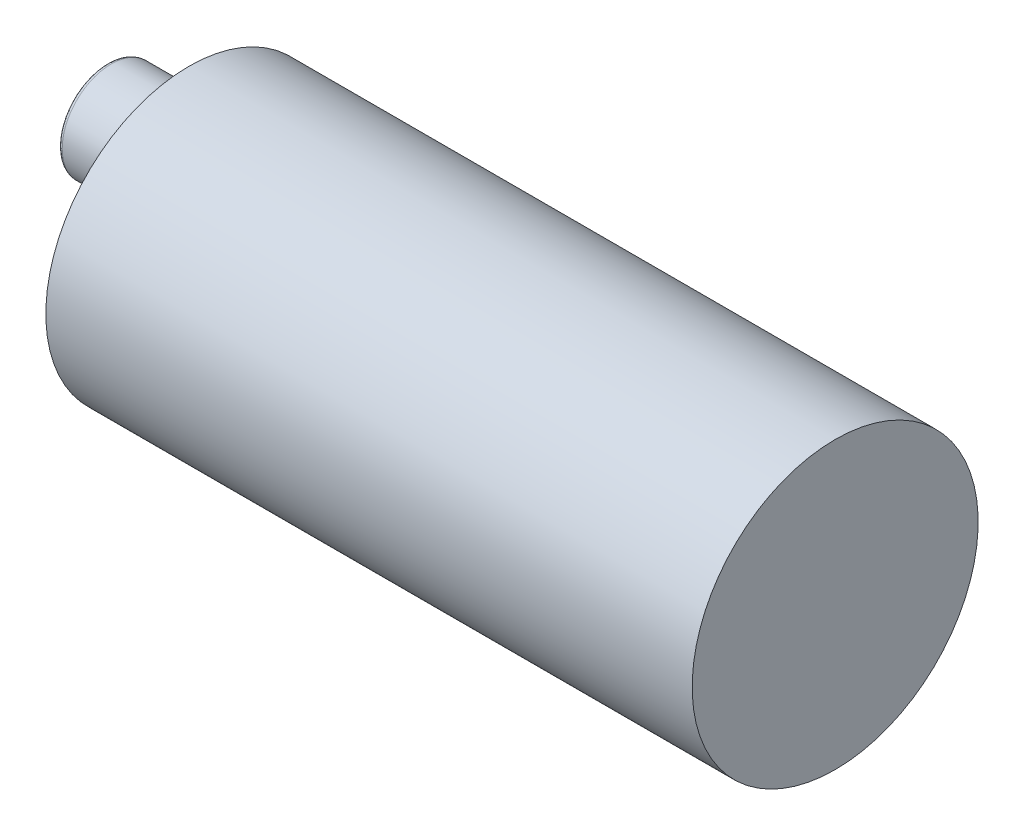
ISO-10303-21;
HEADER;
FILE_DESCRIPTION(('STEP AP214'),'2;1');
FILE_NAME('part.step','',(''),(''),'','','');
FILE_SCHEMA(('AUTOMOTIVE_DESIGN { 1 0 10303 214 1 1 1 1 }'));
ENDSEC;
DATA;
#1=APPLICATION_CONTEXT('core data for automotive mechanical design processes');
#2=APPLICATION_PROTOCOL_DEFINITION('international standard','automotive_design',2000,#1);
#3=PRODUCT_CONTEXT('',#1,'mechanical');
#4=PRODUCT('Part','Part','',(#3));
#5=PRODUCT_RELATED_PRODUCT_CATEGORY('part','',(#4));
#6=PRODUCT_DEFINITION_FORMATION('','',#4);
#7=PRODUCT_DEFINITION_CONTEXT('part definition',#1,'design');
#8=PRODUCT_DEFINITION('design','',#6,#7);
#9=PRODUCT_DEFINITION_SHAPE('','',#8);
#10=(LENGTH_UNIT() NAMED_UNIT(*) SI_UNIT(.MILLI.,.METRE.));
#11=(NAMED_UNIT(*) PLANE_ANGLE_UNIT() SI_UNIT($,.RADIAN.));
#12=(NAMED_UNIT(*) SI_UNIT($,.STERADIAN.) SOLID_ANGLE_UNIT());
#13=UNCERTAINTY_MEASURE_WITH_UNIT(LENGTH_MEASURE(1.E-05),#10,'distance_accuracy_value','');
#14=(GEOMETRIC_REPRESENTATION_CONTEXT(3) GLOBAL_UNCERTAINTY_ASSIGNED_CONTEXT((#13)) GLOBAL_UNIT_ASSIGNED_CONTEXT((#10,
#11,#12)) REPRESENTATION_CONTEXT('',''));
#15=CARTESIAN_POINT('',(0.,0.,0.));
#16=DIRECTION('',(0.,0.,1.));
#17=DIRECTION('',(1.,0.,0.));
#18=AXIS2_PLACEMENT_3D('',#15,#16,#17);
#19=CARTESIAN_POINT('',(-52.9413525029278,7.18283582089552,0.));
#20=DIRECTION('',(-1.,0.,0.));
#21=DIRECTION('',(0.,-1.,0.));
#22=AXIS2_PLACEMENT_3D('',#19,#20,#21);
#23=PLANE('',#22);
#24=CARTESIAN_POINT('',(-52.9413525029278,14.1828358208955,0.));
#25=DIRECTION('',(-1.,0.,0.));
#26=DIRECTION('',(0.,0.,1.));
#27=AXIS2_PLACEMENT_3D('',#24,#25,#26);
#28=CIRCLE('',#27,6.);
#29=CARTESIAN_POINT('',(-52.9413525029278,14.1828358208955,6.));
#30=VERTEX_POINT('',#29);
#31=EDGE_CURVE('E53',#30,#30,#28,.T.);
#32=ORIENTED_EDGE('',*,*,#31,.F.);
#33=EDGE_LOOP('',(#32));
#34=FACE_BOUND('',#33,.T.);
#35=CARTESIAN_POINT('',(-52.9413525029278,7.18283582089552,0.));
#36=DIRECTION('',(-1.,0.,0.));
#37=DIRECTION('',(0.,-1.,0.));
#38=AXIS2_PLACEMENT_3D('',#35,#36,#37);
#39=CIRCLE('',#38,17.5);
#40=CARTESIAN_POINT('',(-52.9413525029278,-10.3171641791045,0.));
#41=VERTEX_POINT('',#40);
#42=EDGE_CURVE('E44',#41,#41,#39,.T.);
#43=ORIENTED_EDGE('',*,*,#42,.T.);
#44=EDGE_LOOP('',(#43));
#45=FACE_BOUND('',#44,.T.);
#46=ADVANCED_FACE('F33',(#34,#45),#23,.T.);
#47=CARTESIAN_POINT('',(-52.9413525029278,7.18283582089552,0.));
#48=DIRECTION('',(-1.,0.,0.));
#49=DIRECTION('',(0.,-1.,0.));
#50=AXIS2_PLACEMENT_3D('',#47,#48,#49);
#51=CYLINDRICAL_SURFACE('',#50,17.5);
#52=CARTESIAN_POINT('',(26.1586474970722,7.18283582089552,0.));
#53=DIRECTION('',(-1.,0.,0.));
#54=DIRECTION('',(0.,-1.,0.));
#55=AXIS2_PLACEMENT_3D('',#52,#53,#54);
#56=CIRCLE('',#55,17.5);
#57=CARTESIAN_POINT('',(26.1586474970722,-10.3171641791045,0.));
#58=VERTEX_POINT('',#57);
#59=EDGE_CURVE('E48',#58,#58,#56,.T.);
#60=ORIENTED_EDGE('',*,*,#59,.T.);
#61=EDGE_LOOP('',(#60));
#62=FACE_BOUND('',#61,.T.);
#63=ORIENTED_EDGE('',*,*,#42,.F.);
#64=EDGE_LOOP('',(#63));
#65=FACE_BOUND('',#64,.T.);
#66=ADVANCED_FACE('F83',(#62,#65),#51,.T.);
#67=CARTESIAN_POINT('',(26.1586474970722,7.18283582089552,0.));
#68=DIRECTION('',(1.,0.,0.));
#69=DIRECTION('',(0.,1.,0.));
#70=AXIS2_PLACEMENT_3D('',#67,#68,#69);
#71=PLANE('',#70);
#72=ORIENTED_EDGE('',*,*,#59,.F.);
#73=EDGE_LOOP('',(#72));
#74=FACE_BOUND('',#73,.T.);
#75=ADVANCED_FACE('F80',(#74),#71,.T.);
#76=CARTESIAN_POINT('',(-62.9413525029278,14.1828358208955,0.));
#77=DIRECTION('',(1.,0.,0.));
#78=DIRECTION('',(0.,1.,0.));
#79=AXIS2_PLACEMENT_3D('',#76,#77,#78);
#80=CYLINDRICAL_SURFACE('',#79,6.);
#81=CARTESIAN_POINT('',(-62.4413525029278,14.1828358208955,0.));
#82=DIRECTION('',(-1.,0.,0.));
#83=DIRECTION('',(0.,0.,1.));
#84=AXIS2_PLACEMENT_3D('',#81,#82,#83);
#85=CIRCLE('',#84,6.);
#86=CARTESIAN_POINT('',(-62.4413525029278,14.1828358208955,6.));
#87=VERTEX_POINT('',#86);
#88=EDGE_CURVE('E10',#87,#87,#85,.F.);
#89=ORIENTED_EDGE('',*,*,#88,.T.);
#90=EDGE_LOOP('',(#89));
#91=FACE_BOUND('',#90,.T.);
#92=ORIENTED_EDGE('',*,*,#31,.T.);
#93=EDGE_LOOP('',(#92));
#94=FACE_BOUND('',#93,.T.);
#95=ADVANCED_FACE('F73',(#91,#94),#80,.T.);
#96=CARTESIAN_POINT('',(-62.9413525029278,0.,0.));
#97=DIRECTION('',(-1.,0.,0.));
#98=DIRECTION('',(0.,0.,1.));
#99=AXIS2_PLACEMENT_3D('',#96,#97,#98);
#100=PLANE('',#99);
#101=CARTESIAN_POINT('',(-62.9413525029278,14.1828358208955,0.));
#102=DIRECTION('',(-1.,0.,0.));
#103=DIRECTION('',(0.,0.,1.));
#104=AXIS2_PLACEMENT_3D('',#101,#102,#103);
#105=CIRCLE('',#104,3.);
#106=CARTESIAN_POINT('',(-62.9413525029278,14.1828358208955,3.));
#107=VERTEX_POINT('',#106);
#108=EDGE_CURVE('E57',#107,#107,#105,.T.);
#109=ORIENTED_EDGE('',*,*,#108,.F.);
#110=EDGE_LOOP('',(#109));
#111=FACE_BOUND('',#110,.T.);
#112=CARTESIAN_POINT('',(-62.9413525029278,14.1828358208955,0.));
#113=DIRECTION('',(-1.,0.,0.));
#114=DIRECTION('',(0.,0.,1.));
#115=AXIS2_PLACEMENT_3D('',#112,#113,#114);
#116=CIRCLE('',#115,5.5);
#117=CARTESIAN_POINT('',(-62.9413525029278,14.1828358208955,5.5));
#118=VERTEX_POINT('',#117);
#119=EDGE_CURVE('E40',#118,#118,#116,.T.);
#120=ORIENTED_EDGE('',*,*,#119,.T.);
#121=EDGE_LOOP('',(#120));
#122=FACE_BOUND('',#121,.T.);
#123=ADVANCED_FACE('F71',(#111,#122),#100,.T.);
#124=CARTESIAN_POINT('',(-62.4413525029278,14.1828358208955,0.));
#125=DIRECTION('',(-1.,0.,0.));
#126=DIRECTION('',(0.,0.,1.));
#127=AXIS2_PLACEMENT_3D('',#124,#125,#126);
#128=TOROIDAL_SURFACE('',#127,5.5,0.5);
#129=ORIENTED_EDGE('',*,*,#88,.F.);
#130=EDGE_LOOP('',(#129));
#131=FACE_BOUND('',#130,.T.);
#132=ORIENTED_EDGE('',*,*,#119,.F.);
#133=EDGE_LOOP('',(#132));
#134=FACE_BOUND('',#133,.T.);
#135=ADVANCED_FACE('F35',(#131,#134),#128,.T.);
#136=CARTESIAN_POINT('',(-59.9413525029278,14.1828358208955,0.));
#137=DIRECTION('',(-1.,0.,0.));
#138=DIRECTION('',(0.,0.,1.));
#139=AXIS2_PLACEMENT_3D('',#136,#137,#138);
#140=CYLINDRICAL_SURFACE('',#139,3.);
#141=CARTESIAN_POINT('',(-59.9413525029278,14.1828358208955,0.));
#142=DIRECTION('',(-1.,0.,0.));
#143=DIRECTION('',(0.,0.,1.));
#144=AXIS2_PLACEMENT_3D('',#141,#142,#143);
#145=CIRCLE('',#144,3.);
#146=CARTESIAN_POINT('',(-59.9413525029278,14.1828358208955,3.));
#147=VERTEX_POINT('',#146);
#148=EDGE_CURVE('E56',#147,#147,#145,.T.);
#149=ORIENTED_EDGE('',*,*,#148,.F.);
#150=EDGE_LOOP('',(#149));
#151=FACE_BOUND('',#150,.T.);
#152=ORIENTED_EDGE('',*,*,#108,.T.);
#153=EDGE_LOOP('',(#152));
#154=FACE_BOUND('',#153,.T.);
#155=ADVANCED_FACE('F65',(#151,#154),#140,.F.);
#156=CARTESIAN_POINT('',(-59.9413525029278,14.1828358208955,0.));
#157=DIRECTION('',(-1.,0.,0.));
#158=DIRECTION('',(0.,0.,1.));
#159=AXIS2_PLACEMENT_3D('',#156,#157,#158);
#160=PLANE('',#159);
#161=ORIENTED_EDGE('',*,*,#148,.T.);
#162=EDGE_LOOP('',(#161));
#163=FACE_BOUND('',#162,.T.);
#164=ADVANCED_FACE('F63',(#163),#160,.T.);
#165=CLOSED_SHELL('',(#46,#66,#75,#95,#123,#135,#155,#164));
#166=MANIFOLD_SOLID_BREP('B2',#165);
#167=ADVANCED_BREP_SHAPE_REPRESENTATION('',(#18,#166),#14);
#168=SHAPE_DEFINITION_REPRESENTATION(#9,#167);
ENDSEC;
END-ISO-10303-21;
